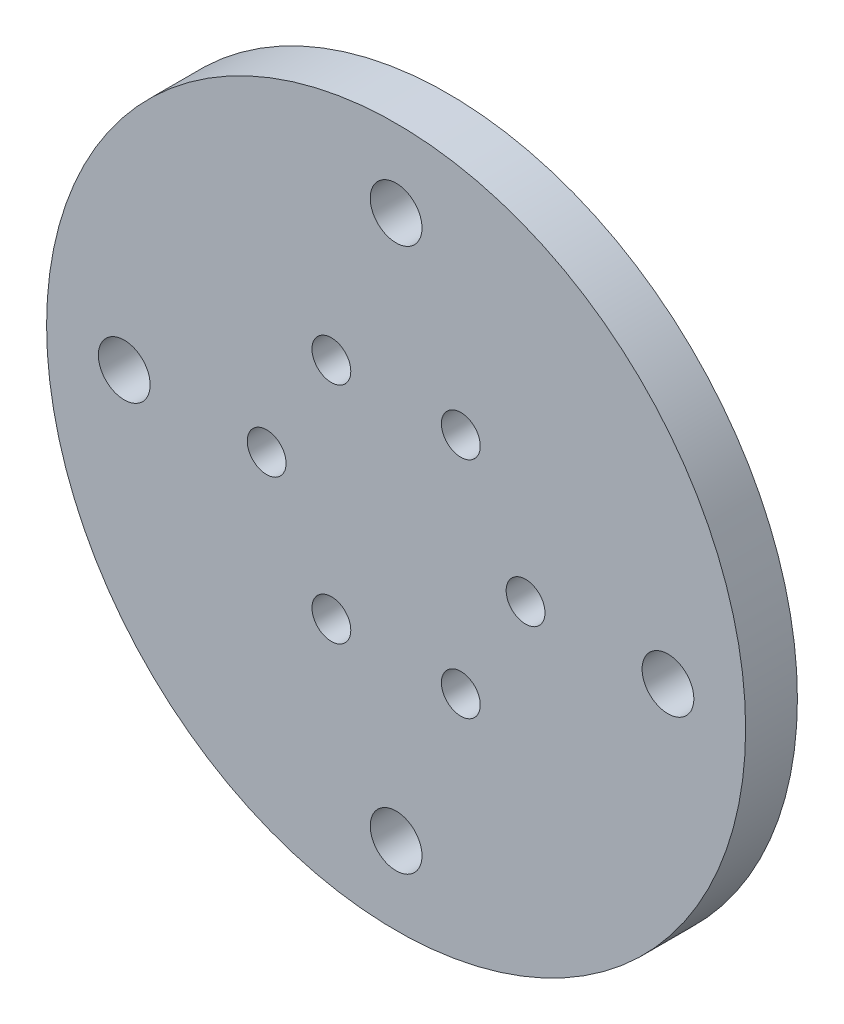
ISO-10303-21;
HEADER;
FILE_DESCRIPTION(('STEP AP214'),'2;1');
FILE_NAME('part.step','',(''),(''),'','','');
FILE_SCHEMA(('AUTOMOTIVE_DESIGN { 1 0 10303 214 1 1 1 1 }'));
ENDSEC;
DATA;
#1=APPLICATION_CONTEXT('core data for automotive mechanical design processes');
#2=APPLICATION_PROTOCOL_DEFINITION('international standard','automotive_design',2000,#1);
#3=PRODUCT_CONTEXT('',#1,'mechanical');
#4=PRODUCT('Part','Part','',(#3));
#5=PRODUCT_RELATED_PRODUCT_CATEGORY('part','',(#4));
#6=PRODUCT_DEFINITION_FORMATION('','',#4);
#7=PRODUCT_DEFINITION_CONTEXT('part definition',#1,'design');
#8=PRODUCT_DEFINITION('design','',#6,#7);
#9=PRODUCT_DEFINITION_SHAPE('','',#8);
#10=(LENGTH_UNIT() NAMED_UNIT(*) SI_UNIT(.MILLI.,.METRE.));
#11=(NAMED_UNIT(*) PLANE_ANGLE_UNIT() SI_UNIT($,.RADIAN.));
#12=(NAMED_UNIT(*) SI_UNIT($,.STERADIAN.) SOLID_ANGLE_UNIT());
#13=UNCERTAINTY_MEASURE_WITH_UNIT(LENGTH_MEASURE(1.E-05),#10,'distance_accuracy_value','');
#14=(GEOMETRIC_REPRESENTATION_CONTEXT(3) GLOBAL_UNCERTAINTY_ASSIGNED_CONTEXT((#13)) GLOBAL_UNIT_ASSIGNED_CONTEXT((#10,
#11,#12)) REPRESENTATION_CONTEXT('',''));
#15=CARTESIAN_POINT('',(0.,0.,0.));
#16=DIRECTION('',(0.,0.,1.));
#17=DIRECTION('',(1.,0.,0.));
#18=AXIS2_PLACEMENT_3D('',#15,#16,#17);
#19=CARTESIAN_POINT('',(0.,0.,4.));
#20=DIRECTION('',(0.,0.,-1.));
#21=DIRECTION('',(-1.,0.,0.));
#22=AXIS2_PLACEMENT_3D('',#19,#20,#21);
#23=CYLINDRICAL_SURFACE('',#22,27.);
#24=CARTESIAN_POINT('',(0.,0.,4.));
#25=DIRECTION('',(0.,0.,1.));
#26=DIRECTION('',(1.,0.,0.));
#27=AXIS2_PLACEMENT_3D('',#24,#25,#26);
#28=CIRCLE('',#27,27.);
#29=CARTESIAN_POINT('',(27.,0.,4.));
#30=VERTEX_POINT('',#29);
#31=EDGE_CURVE('E74',#30,#30,#28,.T.);
#32=ORIENTED_EDGE('',*,*,#31,.F.);
#33=EDGE_LOOP('',(#32));
#34=FACE_BOUND('',#33,.T.);
#35=CARTESIAN_POINT('',(0.,0.,0.));
#36=DIRECTION('',(0.,0.,1.));
#37=DIRECTION('',(1.,0.,0.));
#38=AXIS2_PLACEMENT_3D('',#35,#36,#37);
#39=CIRCLE('',#38,27.);
#40=CARTESIAN_POINT('',(27.,0.,0.));
#41=VERTEX_POINT('',#40);
#42=EDGE_CURVE('E80',#41,#41,#39,.T.);
#43=ORIENTED_EDGE('',*,*,#42,.T.);
#44=EDGE_LOOP('',(#43));
#45=FACE_BOUND('',#44,.T.);
#46=ADVANCED_FACE('F41',(#34,#45),#23,.T.);
#47=CARTESIAN_POINT('',(0.,0.,4.));
#48=DIRECTION('',(0.,0.,1.));
#49=DIRECTION('',(1.,0.,0.));
#50=AXIS2_PLACEMENT_3D('',#47,#48,#49);
#51=PLANE('',#50);
#52=CARTESIAN_POINT('',(-21.,2.19963324347117E-13,4.));
#53=DIRECTION('',(0.,0.,1.));
#54=DIRECTION('',(1.,0.,0.));
#55=AXIS2_PLACEMENT_3D('',#52,#53,#54);
#56=CIRCLE('',#55,2.);
#57=CARTESIAN_POINT('',(-19.,2.19963324347117E-13,4.));
#58=VERTEX_POINT('',#57);
#59=EDGE_CURVE('E105',#58,#58,#56,.T.);
#60=ORIENTED_EDGE('',*,*,#59,.F.);
#61=EDGE_LOOP('',(#60));
#62=FACE_BOUND('',#61,.T.);
#63=CARTESIAN_POINT('',(0.,21.,4.));
#64=DIRECTION('',(0.,0.,1.));
#65=DIRECTION('',(1.,0.,0.));
#66=AXIS2_PLACEMENT_3D('',#63,#64,#65);
#67=CIRCLE('',#66,2.);
#68=CARTESIAN_POINT('',(2.,21.,4.));
#69=VERTEX_POINT('',#68);
#70=EDGE_CURVE('E101',#69,#69,#67,.T.);
#71=ORIENTED_EDGE('',*,*,#70,.F.);
#72=EDGE_LOOP('',(#71));
#73=FACE_BOUND('',#72,.T.);
#74=CARTESIAN_POINT('',(10.,0.,4.));
#75=DIRECTION('',(0.,0.,1.));
#76=DIRECTION('',(1.,0.,0.));
#77=AXIS2_PLACEMENT_3D('',#74,#75,#76);
#78=CIRCLE('',#77,1.5);
#79=CARTESIAN_POINT('',(11.5,0.,4.));
#80=VERTEX_POINT('',#79);
#81=EDGE_CURVE('E114',#80,#80,#78,.T.);
#82=ORIENTED_EDGE('',*,*,#81,.F.);
#83=EDGE_LOOP('',(#82));
#84=FACE_BOUND('',#83,.T.);
#85=CARTESIAN_POINT('',(4.99999999999996,-8.66025403784442,4.));
#86=DIRECTION('',(0.,0.,1.));
#87=DIRECTION('',(1.,0.,0.));
#88=AXIS2_PLACEMENT_3D('',#85,#86,#87);
#89=CIRCLE('',#88,1.5);
#90=CARTESIAN_POINT('',(6.49999999999997,-8.66025403784442,4.));
#91=VERTEX_POINT('',#90);
#92=EDGE_CURVE('E108',#91,#91,#89,.T.);
#93=ORIENTED_EDGE('',*,*,#92,.F.);
#94=EDGE_LOOP('',(#93));
#95=FACE_BOUND('',#94,.T.);
#96=CARTESIAN_POINT('',(-5.00000000000007,-8.66025403784436,4.));
#97=DIRECTION('',(0.,0.,1.));
#98=DIRECTION('',(1.,0.,0.));
#99=AXIS2_PLACEMENT_3D('',#96,#97,#98);
#100=CIRCLE('',#99,1.5);
#101=CARTESIAN_POINT('',(-3.50000000000007,-8.66025403784436,4.));
#102=VERTEX_POINT('',#101);
#103=EDGE_CURVE('E106',#102,#102,#100,.T.);
#104=ORIENTED_EDGE('',*,*,#103,.F.);
#105=EDGE_LOOP('',(#104));
#106=FACE_BOUND('',#105,.T.);
#107=CARTESIAN_POINT('',(-10.,0.,4.));
#108=DIRECTION('',(0.,0.,1.));
#109=DIRECTION('',(1.,0.,0.));
#110=AXIS2_PLACEMENT_3D('',#107,#108,#109);
#111=CIRCLE('',#110,1.5);
#112=CARTESIAN_POINT('',(-8.50000000000001,0.,4.));
#113=VERTEX_POINT('',#112);
#114=EDGE_CURVE('E109',#113,#113,#111,.T.);
#115=ORIENTED_EDGE('',*,*,#114,.F.);
#116=EDGE_LOOP('',(#115));
#117=FACE_BOUND('',#116,.T.);
#118=CARTESIAN_POINT('',(-4.9999999999999,8.66025403784446,4.));
#119=DIRECTION('',(0.,0.,1.));
#120=DIRECTION('',(1.,0.,0.));
#121=AXIS2_PLACEMENT_3D('',#118,#119,#120);
#122=CIRCLE('',#121,1.5);
#123=CARTESIAN_POINT('',(-3.4999999999999,8.66025403784446,4.));
#124=VERTEX_POINT('',#123);
#125=EDGE_CURVE('E125',#124,#124,#122,.T.);
#126=ORIENTED_EDGE('',*,*,#125,.F.);
#127=EDGE_LOOP('',(#126));
#128=FACE_BOUND('',#127,.T.);
#129=CARTESIAN_POINT('',(21.,0.,4.));
#130=DIRECTION('',(0.,0.,1.));
#131=DIRECTION('',(1.,0.,0.));
#132=AXIS2_PLACEMENT_3D('',#129,#130,#131);
#133=CIRCLE('',#132,2.);
#134=CARTESIAN_POINT('',(23.,0.,4.));
#135=VERTEX_POINT('',#134);
#136=EDGE_CURVE('E118',#135,#135,#133,.T.);
#137=ORIENTED_EDGE('',*,*,#136,.F.);
#138=EDGE_LOOP('',(#137));
#139=FACE_BOUND('',#138,.T.);
#140=CARTESIAN_POINT('',(-1.46642216231412E-13,-21.,4.));
#141=DIRECTION('',(0.,0.,1.));
#142=DIRECTION('',(1.,0.,0.));
#143=AXIS2_PLACEMENT_3D('',#140,#141,#142);
#144=CIRCLE('',#143,2.);
#145=CARTESIAN_POINT('',(1.99999999999985,-21.,4.));
#146=VERTEX_POINT('',#145);
#147=EDGE_CURVE('E104',#146,#146,#144,.T.);
#148=ORIENTED_EDGE('',*,*,#147,.F.);
#149=EDGE_LOOP('',(#148));
#150=FACE_BOUND('',#149,.T.);
#151=CARTESIAN_POINT('',(5.00000000000001,8.66025403784439,4.));
#152=DIRECTION('',(0.,0.,1.));
#153=DIRECTION('',(1.,0.,0.));
#154=AXIS2_PLACEMENT_3D('',#151,#152,#153);
#155=CIRCLE('',#154,1.5);
#156=CARTESIAN_POINT('',(6.50000000000001,8.66025403784439,4.));
#157=VERTEX_POINT('',#156);
#158=EDGE_CURVE('E94',#157,#157,#155,.T.);
#159=ORIENTED_EDGE('',*,*,#158,.F.);
#160=EDGE_LOOP('',(#159));
#161=FACE_BOUND('',#160,.T.);
#162=ORIENTED_EDGE('',*,*,#31,.T.);
#163=EDGE_LOOP('',(#162));
#164=FACE_BOUND('',#163,.T.);
#165=ADVANCED_FACE('F134',(#62,#73,#84,#95,#106,#117,#128,#139,#150,#161,#164),#51,.T.);
#166=CARTESIAN_POINT('',(0.,0.,0.));
#167=DIRECTION('',(0.,0.,1.));
#168=DIRECTION('',(1.,0.,0.));
#169=AXIS2_PLACEMENT_3D('',#166,#167,#168);
#170=PLANE('',#169);
#171=CARTESIAN_POINT('',(0.,21.,0.));
#172=DIRECTION('',(0.,0.,1.));
#173=DIRECTION('',(1.,0.,0.));
#174=AXIS2_PLACEMENT_3D('',#171,#172,#173);
#175=CIRCLE('',#174,2.99999999999999);
#176=CARTESIAN_POINT('',(2.99999999999999,21.,0.));
#177=VERTEX_POINT('',#176);
#178=EDGE_CURVE('E64',#177,#177,#175,.T.);
#179=ORIENTED_EDGE('',*,*,#178,.T.);
#180=EDGE_LOOP('',(#179));
#181=FACE_BOUND('',#180,.T.);
#182=CARTESIAN_POINT('',(-1.46642216231412E-13,-21.,0.));
#183=DIRECTION('',(0.,0.,1.));
#184=DIRECTION('',(1.,0.,0.));
#185=AXIS2_PLACEMENT_3D('',#182,#183,#184);
#186=CIRCLE('',#185,2.99999999999999);
#187=CARTESIAN_POINT('',(2.99999999999984,-21.,0.));
#188=VERTEX_POINT('',#187);
#189=EDGE_CURVE('E63',#188,#188,#186,.T.);
#190=ORIENTED_EDGE('',*,*,#189,.T.);
#191=EDGE_LOOP('',(#190));
#192=FACE_BOUND('',#191,.T.);
#193=CARTESIAN_POINT('',(-21.,2.19963324347117E-13,0.));
#194=DIRECTION('',(0.,0.,1.));
#195=DIRECTION('',(1.,0.,0.));
#196=AXIS2_PLACEMENT_3D('',#193,#194,#195);
#197=CIRCLE('',#196,2.99999999999999);
#198=CARTESIAN_POINT('',(-18.,2.19963324347117E-13,0.));
#199=VERTEX_POINT('',#198);
#200=EDGE_CURVE('E70',#199,#199,#197,.T.);
#201=ORIENTED_EDGE('',*,*,#200,.T.);
#202=EDGE_LOOP('',(#201));
#203=FACE_BOUND('',#202,.T.);
#204=CARTESIAN_POINT('',(21.,0.,0.));
#205=DIRECTION('',(0.,0.,1.));
#206=DIRECTION('',(1.,0.,0.));
#207=AXIS2_PLACEMENT_3D('',#204,#205,#206);
#208=CIRCLE('',#207,2.99999999999999);
#209=CARTESIAN_POINT('',(24.,0.,0.));
#210=VERTEX_POINT('',#209);
#211=EDGE_CURVE('E72',#210,#210,#208,.T.);
#212=ORIENTED_EDGE('',*,*,#211,.T.);
#213=EDGE_LOOP('',(#212));
#214=FACE_BOUND('',#213,.T.);
#215=CARTESIAN_POINT('',(10.,0.,0.));
#216=DIRECTION('',(0.,0.,1.));
#217=DIRECTION('',(1.,0.,0.));
#218=AXIS2_PLACEMENT_3D('',#215,#216,#217);
#219=CIRCLE('',#218,1.5);
#220=CARTESIAN_POINT('',(11.5,0.,0.));
#221=VERTEX_POINT('',#220);
#222=EDGE_CURVE('E73',#221,#221,#219,.T.);
#223=ORIENTED_EDGE('',*,*,#222,.T.);
#224=EDGE_LOOP('',(#223));
#225=FACE_BOUND('',#224,.T.);
#226=CARTESIAN_POINT('',(4.99999999999996,-8.66025403784442,0.));
#227=DIRECTION('',(0.,0.,1.));
#228=DIRECTION('',(1.,0.,0.));
#229=AXIS2_PLACEMENT_3D('',#226,#227,#228);
#230=CIRCLE('',#229,1.5);
#231=CARTESIAN_POINT('',(6.49999999999997,-8.66025403784442,0.));
#232=VERTEX_POINT('',#231);
#233=EDGE_CURVE('E76',#232,#232,#230,.T.);
#234=ORIENTED_EDGE('',*,*,#233,.T.);
#235=EDGE_LOOP('',(#234));
#236=FACE_BOUND('',#235,.T.);
#237=CARTESIAN_POINT('',(-5.00000000000007,-8.66025403784436,0.));
#238=DIRECTION('',(0.,0.,1.));
#239=DIRECTION('',(1.,0.,0.));
#240=AXIS2_PLACEMENT_3D('',#237,#238,#239);
#241=CIRCLE('',#240,1.5);
#242=CARTESIAN_POINT('',(-3.50000000000007,-8.66025403784436,0.));
#243=VERTEX_POINT('',#242);
#244=EDGE_CURVE('E81',#243,#243,#241,.T.);
#245=ORIENTED_EDGE('',*,*,#244,.T.);
#246=EDGE_LOOP('',(#245));
#247=FACE_BOUND('',#246,.T.);
#248=CARTESIAN_POINT('',(-10.,0.,0.));
#249=DIRECTION('',(0.,0.,1.));
#250=DIRECTION('',(1.,0.,0.));
#251=AXIS2_PLACEMENT_3D('',#248,#249,#250);
#252=CIRCLE('',#251,1.5);
#253=CARTESIAN_POINT('',(-8.50000000000001,0.,0.));
#254=VERTEX_POINT('',#253);
#255=EDGE_CURVE('E82',#254,#254,#252,.T.);
#256=ORIENTED_EDGE('',*,*,#255,.T.);
#257=EDGE_LOOP('',(#256));
#258=FACE_BOUND('',#257,.T.);
#259=CARTESIAN_POINT('',(-4.9999999999999,8.66025403784446,0.));
#260=DIRECTION('',(0.,0.,1.));
#261=DIRECTION('',(1.,0.,0.));
#262=AXIS2_PLACEMENT_3D('',#259,#260,#261);
#263=CIRCLE('',#262,1.5);
#264=CARTESIAN_POINT('',(-3.4999999999999,8.66025403784446,0.));
#265=VERTEX_POINT('',#264);
#266=EDGE_CURVE('E86',#265,#265,#263,.T.);
#267=ORIENTED_EDGE('',*,*,#266,.T.);
#268=EDGE_LOOP('',(#267));
#269=FACE_BOUND('',#268,.T.);
#270=CARTESIAN_POINT('',(5.00000000000001,8.66025403784439,0.));
#271=DIRECTION('',(0.,0.,1.));
#272=DIRECTION('',(1.,0.,0.));
#273=AXIS2_PLACEMENT_3D('',#270,#271,#272);
#274=CIRCLE('',#273,1.5);
#275=CARTESIAN_POINT('',(6.50000000000001,8.66025403784439,0.));
#276=VERTEX_POINT('',#275);
#277=EDGE_CURVE('E93',#276,#276,#274,.T.);
#278=ORIENTED_EDGE('',*,*,#277,.T.);
#279=EDGE_LOOP('',(#278));
#280=FACE_BOUND('',#279,.T.);
#281=ORIENTED_EDGE('',*,*,#42,.F.);
#282=EDGE_LOOP('',(#281));
#283=FACE_BOUND('',#282,.T.);
#284=ADVANCED_FACE('F133',(#181,#192,#203,#214,#225,#236,#247,#258,#269,#280,#283),#170,.F.);
#285=CARTESIAN_POINT('',(5.00000000000001,8.66025403784439,-6.));
#286=DIRECTION('',(0.,0.,1.));
#287=DIRECTION('',(1.,0.,0.));
#288=AXIS2_PLACEMENT_3D('',#285,#286,#287);
#289=CYLINDRICAL_SURFACE('',#288,1.5);
#290=ORIENTED_EDGE('',*,*,#158,.T.);
#291=EDGE_LOOP('',(#290));
#292=FACE_BOUND('',#291,.T.);
#293=ORIENTED_EDGE('',*,*,#277,.F.);
#294=EDGE_LOOP('',(#293));
#295=FACE_BOUND('',#294,.T.);
#296=ADVANCED_FACE('F152',(#292,#295),#289,.F.);
#297=CARTESIAN_POINT('',(-1.46642216231412E-13,-21.,-6.));
#298=DIRECTION('',(0.,0.,1.));
#299=DIRECTION('',(1.,0.,0.));
#300=AXIS2_PLACEMENT_3D('',#297,#298,#299);
#301=CYLINDRICAL_SURFACE('',#300,2.);
#302=CARTESIAN_POINT('',(-1.46642216231412E-13,-21.,0.999999999999995));
#303=DIRECTION('',(0.,0.,1.));
#304=DIRECTION('',(1.,0.,0.));
#305=AXIS2_PLACEMENT_3D('',#302,#303,#304);
#306=CIRCLE('',#305,2.);
#307=CARTESIAN_POINT('',(1.99999999999985,-21.,0.999999999999995));
#308=VERTEX_POINT('',#307);
#309=EDGE_CURVE('E52',#308,#308,#306,.F.);
#310=ORIENTED_EDGE('',*,*,#309,.T.);
#311=EDGE_LOOP('',(#310));
#312=FACE_BOUND('',#311,.T.);
#313=ORIENTED_EDGE('',*,*,#147,.T.);
#314=EDGE_LOOP('',(#313));
#315=FACE_BOUND('',#314,.T.);
#316=ADVANCED_FACE('F165',(#312,#315),#301,.F.);
#317=CARTESIAN_POINT('',(21.,0.,-6.));
#318=DIRECTION('',(0.,0.,1.));
#319=DIRECTION('',(1.,0.,0.));
#320=AXIS2_PLACEMENT_3D('',#317,#318,#319);
#321=CYLINDRICAL_SURFACE('',#320,2.);
#322=CARTESIAN_POINT('',(21.,0.,0.999999999999994));
#323=DIRECTION('',(0.,0.,1.));
#324=DIRECTION('',(1.,0.,0.));
#325=AXIS2_PLACEMENT_3D('',#322,#323,#324);
#326=CIRCLE('',#325,2.);
#327=CARTESIAN_POINT('',(23.,0.,0.999999999999994));
#328=VERTEX_POINT('',#327);
#329=EDGE_CURVE('E10',#328,#328,#326,.F.);
#330=ORIENTED_EDGE('',*,*,#329,.T.);
#331=EDGE_LOOP('',(#330));
#332=FACE_BOUND('',#331,.T.);
#333=ORIENTED_EDGE('',*,*,#136,.T.);
#334=EDGE_LOOP('',(#333));
#335=FACE_BOUND('',#334,.T.);
#336=ADVANCED_FACE('F215',(#332,#335),#321,.F.);
#337=CARTESIAN_POINT('',(-4.9999999999999,8.66025403784446,-6.));
#338=DIRECTION('',(0.,0.,1.));
#339=DIRECTION('',(1.,0.,0.));
#340=AXIS2_PLACEMENT_3D('',#337,#338,#339);
#341=CYLINDRICAL_SURFACE('',#340,1.5);
#342=ORIENTED_EDGE('',*,*,#125,.T.);
#343=EDGE_LOOP('',(#342));
#344=FACE_BOUND('',#343,.T.);
#345=ORIENTED_EDGE('',*,*,#266,.F.);
#346=EDGE_LOOP('',(#345));
#347=FACE_BOUND('',#346,.T.);
#348=ADVANCED_FACE('F209',(#344,#347),#341,.F.);
#349=CARTESIAN_POINT('',(-10.,0.,-6.));
#350=DIRECTION('',(0.,0.,1.));
#351=DIRECTION('',(1.,0.,0.));
#352=AXIS2_PLACEMENT_3D('',#349,#350,#351);
#353=CYLINDRICAL_SURFACE('',#352,1.5);
#354=ORIENTED_EDGE('',*,*,#114,.T.);
#355=EDGE_LOOP('',(#354));
#356=FACE_BOUND('',#355,.T.);
#357=ORIENTED_EDGE('',*,*,#255,.F.);
#358=EDGE_LOOP('',(#357));
#359=FACE_BOUND('',#358,.T.);
#360=ADVANCED_FACE('F129',(#356,#359),#353,.F.);
#361=CARTESIAN_POINT('',(-5.00000000000007,-8.66025403784436,-6.));
#362=DIRECTION('',(0.,0.,1.));
#363=DIRECTION('',(1.,0.,0.));
#364=AXIS2_PLACEMENT_3D('',#361,#362,#363);
#365=CYLINDRICAL_SURFACE('',#364,1.5);
#366=ORIENTED_EDGE('',*,*,#103,.T.);
#367=EDGE_LOOP('',(#366));
#368=FACE_BOUND('',#367,.T.);
#369=ORIENTED_EDGE('',*,*,#244,.F.);
#370=EDGE_LOOP('',(#369));
#371=FACE_BOUND('',#370,.T.);
#372=ADVANCED_FACE('F217',(#368,#371),#365,.F.);
#373=CARTESIAN_POINT('',(4.99999999999996,-8.66025403784442,-6.));
#374=DIRECTION('',(0.,0.,1.));
#375=DIRECTION('',(1.,0.,0.));
#376=AXIS2_PLACEMENT_3D('',#373,#374,#375);
#377=CYLINDRICAL_SURFACE('',#376,1.5);
#378=ORIENTED_EDGE('',*,*,#92,.T.);
#379=EDGE_LOOP('',(#378));
#380=FACE_BOUND('',#379,.T.);
#381=ORIENTED_EDGE('',*,*,#233,.F.);
#382=EDGE_LOOP('',(#381));
#383=FACE_BOUND('',#382,.T.);
#384=ADVANCED_FACE('F234',(#380,#383),#377,.F.);
#385=CARTESIAN_POINT('',(10.,0.,-6.));
#386=DIRECTION('',(0.,0.,1.));
#387=DIRECTION('',(1.,0.,0.));
#388=AXIS2_PLACEMENT_3D('',#385,#386,#387);
#389=CYLINDRICAL_SURFACE('',#388,1.5);
#390=ORIENTED_EDGE('',*,*,#81,.T.);
#391=EDGE_LOOP('',(#390));
#392=FACE_BOUND('',#391,.T.);
#393=ORIENTED_EDGE('',*,*,#222,.F.);
#394=EDGE_LOOP('',(#393));
#395=FACE_BOUND('',#394,.T.);
#396=ADVANCED_FACE('F230',(#392,#395),#389,.F.);
#397=CARTESIAN_POINT('',(0.,21.,-6.));
#398=DIRECTION('',(0.,0.,1.));
#399=DIRECTION('',(1.,0.,0.));
#400=AXIS2_PLACEMENT_3D('',#397,#398,#399);
#401=CYLINDRICAL_SURFACE('',#400,2.);
#402=CARTESIAN_POINT('',(0.,21.,0.999999999999995));
#403=DIRECTION('',(0.,0.,1.));
#404=DIRECTION('',(1.,0.,0.));
#405=AXIS2_PLACEMENT_3D('',#402,#403,#404);
#406=CIRCLE('',#405,2.);
#407=CARTESIAN_POINT('',(2.,21.,0.999999999999995));
#408=VERTEX_POINT('',#407);
#409=EDGE_CURVE('E60',#408,#408,#406,.F.);
#410=ORIENTED_EDGE('',*,*,#409,.T.);
#411=EDGE_LOOP('',(#410));
#412=FACE_BOUND('',#411,.T.);
#413=ORIENTED_EDGE('',*,*,#70,.T.);
#414=EDGE_LOOP('',(#413));
#415=FACE_BOUND('',#414,.T.);
#416=ADVANCED_FACE('F223',(#412,#415),#401,.F.);
#417=CARTESIAN_POINT('',(-21.,2.19963324347117E-13,-6.));
#418=DIRECTION('',(0.,0.,1.));
#419=DIRECTION('',(1.,0.,0.));
#420=AXIS2_PLACEMENT_3D('',#417,#418,#419);
#421=CYLINDRICAL_SURFACE('',#420,2.);
#422=CARTESIAN_POINT('',(-21.,2.19963324347117E-13,0.999999999999995));
#423=DIRECTION('',(0.,0.,1.));
#424=DIRECTION('',(1.,0.,0.));
#425=AXIS2_PLACEMENT_3D('',#422,#423,#424);
#426=CIRCLE('',#425,2.);
#427=CARTESIAN_POINT('',(-19.,2.19963324347117E-13,0.999999999999995));
#428=VERTEX_POINT('',#427);
#429=EDGE_CURVE('E47',#428,#428,#426,.F.);
#430=ORIENTED_EDGE('',*,*,#429,.T.);
#431=EDGE_LOOP('',(#430));
#432=FACE_BOUND('',#431,.T.);
#433=ORIENTED_EDGE('',*,*,#59,.T.);
#434=EDGE_LOOP('',(#433));
#435=FACE_BOUND('',#434,.T.);
#436=ADVANCED_FACE('F173',(#432,#435),#421,.F.);
#437=CARTESIAN_POINT('',(0.,21.,0.));
#438=DIRECTION('',(0.,0.,-1.));
#439=DIRECTION('',(-1.,0.,0.));
#440=AXIS2_PLACEMENT_3D('',#437,#438,#439);
#441=CONICAL_SURFACE('',#440,2.99999999999999,0.785398163397445);
#442=ORIENTED_EDGE('',*,*,#409,.F.);
#443=EDGE_LOOP('',(#442));
#444=FACE_BOUND('',#443,.T.);
#445=ORIENTED_EDGE('',*,*,#178,.F.);
#446=EDGE_LOOP('',(#445));
#447=FACE_BOUND('',#446,.T.);
#448=ADVANCED_FACE('F169',(#444,#447),#441,.F.);
#449=CARTESIAN_POINT('',(-1.46642216231412E-13,-21.,0.));
#450=DIRECTION('',(0.,0.,-1.));
#451=DIRECTION('',(-1.,0.,0.));
#452=AXIS2_PLACEMENT_3D('',#449,#450,#451);
#453=CONICAL_SURFACE('',#452,2.99999999999999,0.785398163397445);
#454=ORIENTED_EDGE('',*,*,#309,.F.);
#455=EDGE_LOOP('',(#454));
#456=FACE_BOUND('',#455,.T.);
#457=ORIENTED_EDGE('',*,*,#189,.F.);
#458=EDGE_LOOP('',(#457));
#459=FACE_BOUND('',#458,.T.);
#460=ADVANCED_FACE('F171',(#456,#459),#453,.F.);
#461=CARTESIAN_POINT('',(-21.,2.19963324347117E-13,0.));
#462=DIRECTION('',(0.,0.,-1.));
#463=DIRECTION('',(-1.,0.,0.));
#464=AXIS2_PLACEMENT_3D('',#461,#462,#463);
#465=CONICAL_SURFACE('',#464,2.99999999999999,0.785398163397445);
#466=ORIENTED_EDGE('',*,*,#429,.F.);
#467=EDGE_LOOP('',(#466));
#468=FACE_BOUND('',#467,.T.);
#469=ORIENTED_EDGE('',*,*,#200,.F.);
#470=EDGE_LOOP('',(#469));
#471=FACE_BOUND('',#470,.T.);
#472=ADVANCED_FACE('F182',(#468,#471),#465,.F.);
#473=CARTESIAN_POINT('',(21.,0.,0.));
#474=DIRECTION('',(0.,0.,-1.));
#475=DIRECTION('',(-1.,0.,0.));
#476=AXIS2_PLACEMENT_3D('',#473,#474,#475);
#477=CONICAL_SURFACE('',#476,2.99999999999999,0.785398163397445);
#478=ORIENTED_EDGE('',*,*,#329,.F.);
#479=EDGE_LOOP('',(#478));
#480=FACE_BOUND('',#479,.T.);
#481=ORIENTED_EDGE('',*,*,#211,.F.);
#482=EDGE_LOOP('',(#481));
#483=FACE_BOUND('',#482,.T.);
#484=ADVANCED_FACE('F42',(#480,#483),#477,.F.);
#485=CLOSED_SHELL('',(#46,#165,#284,#296,#316,#336,#348,#360,#372,#384,#396,#416,#436,#448,#460,
#472,#484));
#486=MANIFOLD_SOLID_BREP('B2',#485);
#487=ADVANCED_BREP_SHAPE_REPRESENTATION('',(#18,#486),#14);
#488=SHAPE_DEFINITION_REPRESENTATION(#9,#487);
ENDSEC;
END-ISO-10303-21;
